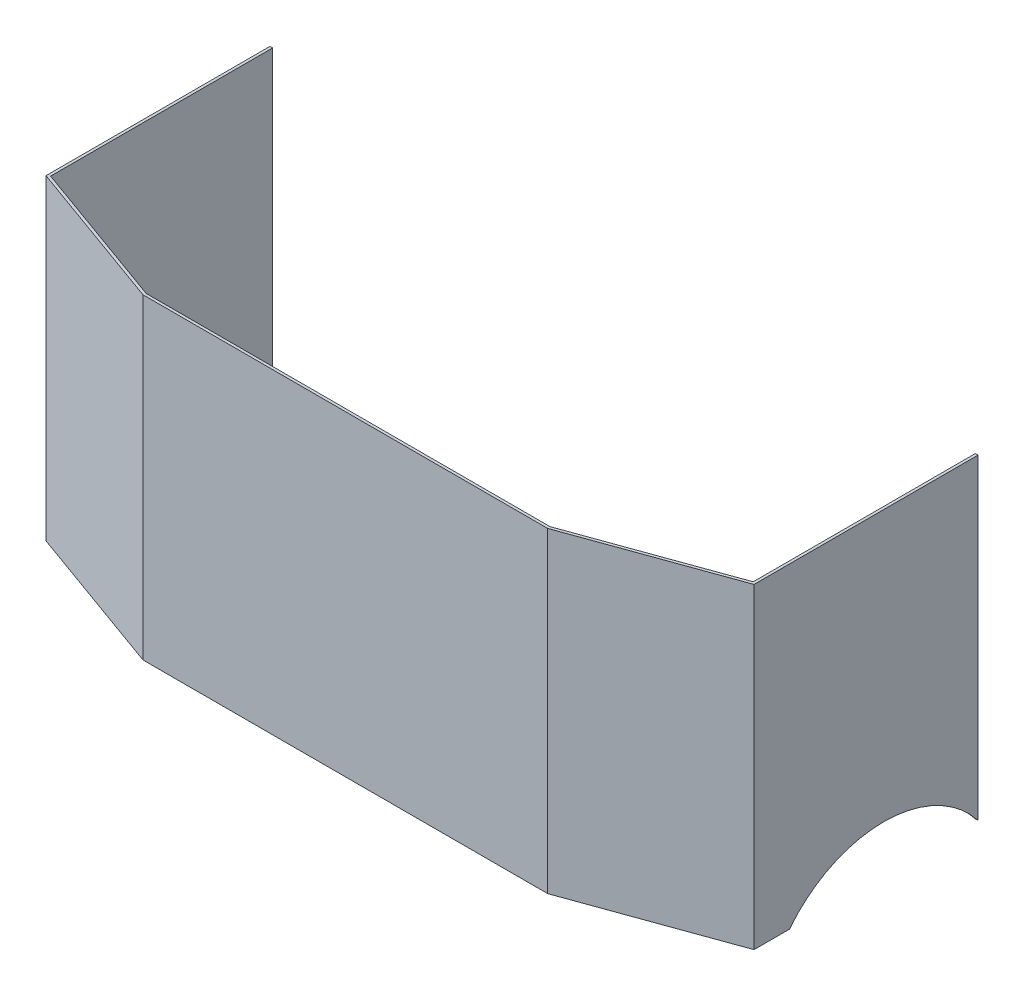
ISO-10303-21;
HEADER;
FILE_DESCRIPTION(('STEP AP214'),'2;1');
FILE_NAME('part.step','',(''),(''),'','','');
FILE_SCHEMA(('AUTOMOTIVE_DESIGN { 1 0 10303 214 1 1 1 1 }'));
ENDSEC;
DATA;
#1=APPLICATION_CONTEXT('core data for automotive mechanical design processes');
#2=APPLICATION_PROTOCOL_DEFINITION('international standard','automotive_design',2000,#1);
#3=PRODUCT_CONTEXT('',#1,'mechanical');
#4=PRODUCT('Part','Part','',(#3));
#5=PRODUCT_RELATED_PRODUCT_CATEGORY('part','',(#4));
#6=PRODUCT_DEFINITION_FORMATION('','',#4);
#7=PRODUCT_DEFINITION_CONTEXT('part definition',#1,'design');
#8=PRODUCT_DEFINITION('design','',#6,#7);
#9=PRODUCT_DEFINITION_SHAPE('','',#8);
#10=(LENGTH_UNIT() NAMED_UNIT(*) SI_UNIT(.MILLI.,.METRE.));
#11=(NAMED_UNIT(*) PLANE_ANGLE_UNIT() SI_UNIT($,.RADIAN.));
#12=(NAMED_UNIT(*) SI_UNIT($,.STERADIAN.) SOLID_ANGLE_UNIT());
#13=UNCERTAINTY_MEASURE_WITH_UNIT(LENGTH_MEASURE(1.E-05),#10,'distance_accuracy_value','');
#14=(GEOMETRIC_REPRESENTATION_CONTEXT(3) GLOBAL_UNCERTAINTY_ASSIGNED_CONTEXT((#13)) GLOBAL_UNIT_ASSIGNED_CONTEXT((#10,
#11,#12)) REPRESENTATION_CONTEXT('',''));
#15=CARTESIAN_POINT('',(0.,0.,0.));
#16=DIRECTION('',(0.,0.,1.));
#17=DIRECTION('',(1.,0.,0.));
#18=AXIS2_PLACEMENT_3D('',#15,#16,#17);
#19=CARTESIAN_POINT('',(0.,0.,0.));
#20=DIRECTION('',(0.,1.,0.));
#21=DIRECTION('',(0.,0.,1.));
#22=AXIS2_PLACEMENT_3D('',#19,#20,#21);
#23=PLANE('',#22);
#24=DIRECTION('',(0.,0.,-1.));
#25=VECTOR('',#24,1.);
#26=CARTESIAN_POINT('',(263.000000064,0.,121.405176327402));
#27=LINE('',#26,#25);
#28=CARTESIAN_POINT('',(263.000000064,0.,-45.0012142751816));
#29=VERTEX_POINT('',#28);
#30=CARTESIAN_POINT('',(263.000000064,0.,-45.0034531183573));
#31=VERTEX_POINT('',#30);
#32=EDGE_CURVE('E148',#29,#31,#27,.T.);
#33=ORIENTED_EDGE('',*,*,#32,.F.);
#34=DIRECTION('',(-1.,0.,0.));
#35=VECTOR('',#34,1.);
#36=CARTESIAN_POINT('',(514.447171453936,0.,-45.0012142751816));
#37=LINE('',#36,#35);
#38=CARTESIAN_POINT('',(261.,0.,-45.0012142751816));
#39=VERTEX_POINT('',#38);
#40=EDGE_CURVE('E11',#29,#39,#37,.T.);
#41=ORIENTED_EDGE('',*,*,#40,.T.);
#42=DIRECTION('',(0.,0.,1.));
#43=VECTOR('',#42,1.);
#44=CARTESIAN_POINT('',(261.,0.,120.));
#45=LINE('',#44,#43);
#46=CARTESIAN_POINT('',(261.,0.,-45.0034531183573));
#47=VERTEX_POINT('',#46);
#48=EDGE_CURVE('E165',#47,#39,#45,.T.);
#49=ORIENTED_EDGE('',*,*,#48,.F.);
#50=DIRECTION('',(-1.,0.,0.));
#51=VECTOR('',#50,1.);
#52=CARTESIAN_POINT('',(263.000000064,0.,-45.0034531183573));
#53=LINE('',#52,#51);
#54=EDGE_CURVE('E156',#31,#47,#53,.T.);
#55=ORIENTED_EDGE('',*,*,#54,.F.);
#56=EDGE_LOOP('',(#33,#41,#49,#55));
#57=FACE_BOUND('',#56,.T.);
#58=ADVANCED_FACE('F33',(#57),#23,.F.);
#59=CARTESIAN_POINT('',(-263.000000064,234.9999999,-45.0012142751814));
#60=DIRECTION('',(-9.02056178642154E-13,0.,1.));
#61=DIRECTION('',(1.,0.,9.02056178642154E-13));
#62=AXIS2_PLACEMENT_3D('',#59,#60,#61);
#63=PLANE('',#62);
#64=DIRECTION('',(-1.,0.,-9.02056178642154E-13));
#65=VECTOR('',#64,1.);
#66=CARTESIAN_POINT('',(-263.000000064,0.,-45.0012142751814));
#67=LINE('',#66,#65);
#68=CARTESIAN_POINT('',(-261.,2.60208521396521E-12,-45.0012142751796));
#69=VERTEX_POINT('',#68);
#70=CARTESIAN_POINT('',(-263.000000064,0.,-45.0012142751816));
#71=VERTEX_POINT('',#70);
#72=EDGE_CURVE('E248',#69,#71,#67,.T.);
#73=ORIENTED_EDGE('',*,*,#72,.T.);
#74=DIRECTION('',(0.,-1.,0.));
#75=VECTOR('',#74,1.);
#76=CARTESIAN_POINT('',(-263.000000064,234.9999999,-45.0012142751814));
#77=LINE('',#76,#75);
#78=CARTESIAN_POINT('',(-263.000000064,234.9999999,-45.0012142751814));
#79=VERTEX_POINT('',#78);
#80=EDGE_CURVE('E209',#79,#71,#77,.T.);
#81=ORIENTED_EDGE('',*,*,#80,.F.);
#82=DIRECTION('',(-1.,0.,-9.02056178642154E-13));
#83=VECTOR('',#82,1.);
#84=CARTESIAN_POINT('',(-263.000000064,234.9999999,-45.0012142751814));
#85=LINE('',#84,#83);
#86=CARTESIAN_POINT('',(-261.,234.9999999,-45.0012142751796));
#87=VERTEX_POINT('',#86);
#88=EDGE_CURVE('E176',#87,#79,#85,.T.);
#89=ORIENTED_EDGE('',*,*,#88,.F.);
#90=DIRECTION('',(0.,-1.,0.));
#91=VECTOR('',#90,1.);
#92=CARTESIAN_POINT('',(-261.,234.9999999,-45.0012142751796));
#93=LINE('',#92,#91);
#94=EDGE_CURVE('E177',#87,#69,#93,.T.);
#95=ORIENTED_EDGE('',*,*,#94,.T.);
#96=EDGE_LOOP('',(#73,#81,#89,#95));
#97=FACE_BOUND('',#96,.T.);
#98=ADVANCED_FACE('F35',(#97),#63,.F.);
#99=CARTESIAN_POINT('',(-263.000000064,234.9999999,-45.0012142751814));
#100=DIRECTION('',(1.,0.,0.));
#101=DIRECTION('',(0.,0.,-1.));
#102=AXIS2_PLACEMENT_3D('',#99,#100,#101);
#103=PLANE('',#102);
#104=ORIENTED_EDGE('',*,*,#80,.T.);
#105=CARTESIAN_POINT('',(-263.000000064,-54.8000000803362,24.9999999371103));
#106=DIRECTION('',(-1.,0.,0.));
#107=DIRECTION('',(0.,0.,1.));
#108=AXIS2_PLACEMENT_3D('',#105,#106,#107);
#109=CIRCLE('',#108,88.9000000000002);
#110=CARTESIAN_POINT('',(-263.000000064,0.,95.0012141494022));
#111=VERTEX_POINT('',#110);
#112=EDGE_CURVE('E153',#111,#71,#109,.T.);
#113=ORIENTED_EDGE('',*,*,#112,.F.);
#114=DIRECTION('',(0.,0.,1.));
#115=VECTOR('',#114,1.);
#116=CARTESIAN_POINT('',(-263.000000064,0.,-45.0012142751814));
#117=LINE('',#116,#115);
#118=CARTESIAN_POINT('',(-263.000000064,0.,121.405176327402));
#119=VERTEX_POINT('',#118);
#120=EDGE_CURVE('E219',#111,#119,#117,.T.);
#121=ORIENTED_EDGE('',*,*,#120,.T.);
#122=DIRECTION('',(0.,-1.,0.));
#123=VECTOR('',#122,1.);
#124=CARTESIAN_POINT('',(-263.000000064,234.9999999,121.405176327402));
#125=LINE('',#124,#123);
#126=CARTESIAN_POINT('',(-263.000000064,234.9999999,121.405176327402));
#127=VERTEX_POINT('',#126);
#128=EDGE_CURVE('E206',#127,#119,#125,.T.);
#129=ORIENTED_EDGE('',*,*,#128,.F.);
#130=DIRECTION('',(0.,0.,1.));
#131=VECTOR('',#130,1.);
#132=CARTESIAN_POINT('',(-263.000000064,234.9999999,-45.0012142751814));
#133=LINE('',#132,#131);
#134=EDGE_CURVE('E254',#79,#127,#133,.T.);
#135=ORIENTED_EDGE('',*,*,#134,.F.);
#136=EDGE_LOOP('',(#104,#113,#121,#129,#135));
#137=FACE_BOUND('',#136,.T.);
#138=ADVANCED_FACE('F294',(#137),#103,.F.);
#139=CARTESIAN_POINT('',(-263.000000064,234.9999999,121.405176327402));
#140=DIRECTION('',(0.339019574601853,0.,-0.940779319520141));
#141=DIRECTION('',(-0.940779319520141,0.,-0.339019574601853));
#142=AXIS2_PLACEMENT_3D('',#139,#140,#141);
#143=PLANE('',#142);
#144=DIRECTION('',(0.94077931952014,0.,0.339019574601853));
#145=VECTOR('',#144,1.);
#146=CARTESIAN_POINT('',(-263.000000064,0.,121.405176327402));
#147=LINE('',#146,#145);
#148=CARTESIAN_POINT('',(-150.349364372541,0.,162.));
#149=VERTEX_POINT('',#148);
#150=EDGE_CURVE('E274',#119,#149,#147,.T.);
#151=ORIENTED_EDGE('',*,*,#150,.T.);
#152=DIRECTION('',(0.,-1.,0.));
#153=VECTOR('',#152,1.);
#154=CARTESIAN_POINT('',(-150.349364372541,234.9999999,162.));
#155=LINE('',#154,#153);
#156=CARTESIAN_POINT('',(-150.349364372541,234.9999999,162.));
#157=VERTEX_POINT('',#156);
#158=EDGE_CURVE('E203',#157,#149,#155,.T.);
#159=ORIENTED_EDGE('',*,*,#158,.F.);
#160=DIRECTION('',(0.94077931952014,0.,0.339019574601853));
#161=VECTOR('',#160,1.);
#162=CARTESIAN_POINT('',(-263.000000064,234.9999999,121.405176327402));
#163=LINE('',#162,#161);
#164=EDGE_CURVE('E256',#127,#157,#163,.T.);
#165=ORIENTED_EDGE('',*,*,#164,.F.);
#166=ORIENTED_EDGE('',*,*,#128,.T.);
#167=EDGE_LOOP('',(#151,#159,#165,#166));
#168=FACE_BOUND('',#167,.T.);
#169=ADVANCED_FACE('F292',(#168),#143,.F.);
#170=CARTESIAN_POINT('',(-150.349364372541,234.9999999,162.));
#171=DIRECTION('',(0.,0.,-1.));
#172=DIRECTION('',(-1.,0.,0.));
#173=AXIS2_PLACEMENT_3D('',#170,#171,#172);
#174=PLANE('',#173);
#175=DIRECTION('',(1.,0.,0.));
#176=VECTOR('',#175,1.);
#177=CARTESIAN_POINT('',(-150.349364372541,0.,162.));
#178=LINE('',#177,#176);
#179=CARTESIAN_POINT('',(150.34936437254,0.,162.));
#180=VERTEX_POINT('',#179);
#181=EDGE_CURVE('E159',#149,#180,#178,.T.);
#182=ORIENTED_EDGE('',*,*,#181,.T.);
#183=DIRECTION('',(0.,-1.,0.));
#184=VECTOR('',#183,1.);
#185=CARTESIAN_POINT('',(150.34936437254,234.9999999,162.));
#186=LINE('',#185,#184);
#187=CARTESIAN_POINT('',(150.34936437254,234.9999999,162.));
#188=VERTEX_POINT('',#187);
#189=EDGE_CURVE('E200',#188,#180,#186,.T.);
#190=ORIENTED_EDGE('',*,*,#189,.F.);
#191=DIRECTION('',(1.,0.,0.));
#192=VECTOR('',#191,1.);
#193=CARTESIAN_POINT('',(-150.349364372541,234.9999999,162.));
#194=LINE('',#193,#192);
#195=EDGE_CURVE('E258',#157,#188,#194,.T.);
#196=ORIENTED_EDGE('',*,*,#195,.F.);
#197=ORIENTED_EDGE('',*,*,#158,.T.);
#198=EDGE_LOOP('',(#182,#190,#196,#197));
#199=FACE_BOUND('',#198,.T.);
#200=ADVANCED_FACE('F278',(#199),#174,.F.);
#201=CARTESIAN_POINT('',(150.34936437254,234.9999999,162.));
#202=DIRECTION('',(-0.339019574601853,0.,-0.940779319520141));
#203=DIRECTION('',(-0.940779319520141,0.,0.339019574601853));
#204=AXIS2_PLACEMENT_3D('',#201,#202,#203);
#205=PLANE('',#204);
#206=DIRECTION('',(0.94077931952014,0.,-0.339019574601853));
#207=VECTOR('',#206,1.);
#208=CARTESIAN_POINT('',(150.34936437254,0.,162.));
#209=LINE('',#208,#207);
#210=CARTESIAN_POINT('',(263.000000064,0.,121.405176327402));
#211=VERTEX_POINT('',#210);
#212=EDGE_CURVE('E157',#180,#211,#209,.T.);
#213=ORIENTED_EDGE('',*,*,#212,.T.);
#214=DIRECTION('',(0.,-1.,0.));
#215=VECTOR('',#214,1.);
#216=CARTESIAN_POINT('',(263.000000064,234.9999999,121.405176327402));
#217=LINE('',#216,#215);
#218=CARTESIAN_POINT('',(263.000000064,234.9999999,121.405176327402));
#219=VERTEX_POINT('',#218);
#220=EDGE_CURVE('E198',#219,#211,#217,.T.);
#221=ORIENTED_EDGE('',*,*,#220,.F.);
#222=DIRECTION('',(0.94077931952014,0.,-0.339019574601853));
#223=VECTOR('',#222,1.);
#224=CARTESIAN_POINT('',(150.34936437254,234.9999999,162.));
#225=LINE('',#224,#223);
#226=EDGE_CURVE('E260',#188,#219,#225,.T.);
#227=ORIENTED_EDGE('',*,*,#226,.F.);
#228=ORIENTED_EDGE('',*,*,#189,.T.);
#229=EDGE_LOOP('',(#213,#221,#227,#228));
#230=FACE_BOUND('',#229,.T.);
#231=ADVANCED_FACE('F284',(#230),#205,.F.);
#232=CARTESIAN_POINT('',(263.000000064,234.9999999,121.405176327402));
#233=DIRECTION('',(-1.,0.,0.));
#234=DIRECTION('',(0.,0.,1.));
#235=AXIS2_PLACEMENT_3D('',#232,#233,#234);
#236=PLANE('',#235);
#237=CARTESIAN_POINT('',(263.000000064,0.,95.0012141494022));
#238=VERTEX_POINT('',#237);
#239=EDGE_CURVE('E152',#211,#238,#27,.T.);
#240=ORIENTED_EDGE('',*,*,#239,.T.);
#241=CARTESIAN_POINT('',(263.000000064,-54.8000000803362,24.9999999371103));
#242=DIRECTION('',(-1.,0.,0.));
#243=DIRECTION('',(0.,0.,1.));
#244=AXIS2_PLACEMENT_3D('',#241,#242,#243);
#245=CIRCLE('',#244,88.9000000000002);
#246=EDGE_CURVE('E48',#29,#238,#245,.F.);
#247=ORIENTED_EDGE('',*,*,#246,.F.);
#248=ORIENTED_EDGE('',*,*,#32,.T.);
#249=DIRECTION('',(0.,-1.,0.));
#250=VECTOR('',#249,1.);
#251=CARTESIAN_POINT('',(263.000000064,234.9999999,-45.0034531183573));
#252=LINE('',#251,#250);
#253=CARTESIAN_POINT('',(263.000000064,234.9999999,-45.0034531183573));
#254=VERTEX_POINT('',#253);
#255=EDGE_CURVE('E196',#254,#31,#252,.T.);
#256=ORIENTED_EDGE('',*,*,#255,.F.);
#257=DIRECTION('',(0.,0.,-1.));
#258=VECTOR('',#257,1.);
#259=CARTESIAN_POINT('',(263.000000064,234.9999999,121.405176327402));
#260=LINE('',#259,#258);
#261=EDGE_CURVE('E262',#219,#254,#260,.T.);
#262=ORIENTED_EDGE('',*,*,#261,.F.);
#263=ORIENTED_EDGE('',*,*,#220,.T.);
#264=EDGE_LOOP('',(#240,#247,#248,#256,#262,#263));
#265=FACE_BOUND('',#264,.T.);
#266=ADVANCED_FACE('F146',(#265),#236,.F.);
#267=CARTESIAN_POINT('',(263.000000064,234.9999999,-45.0034531183573));
#268=DIRECTION('',(0.,0.,1.));
#269=DIRECTION('',(1.,0.,0.));
#270=AXIS2_PLACEMENT_3D('',#267,#268,#269);
#271=PLANE('',#270);
#272=ORIENTED_EDGE('',*,*,#54,.T.);
#273=DIRECTION('',(0.,-1.,0.));
#274=VECTOR('',#273,1.);
#275=CARTESIAN_POINT('',(261.,234.9999999,-45.0034531183573));
#276=LINE('',#275,#274);
#277=CARTESIAN_POINT('',(261.,234.9999999,-45.0034531183573));
#278=VERTEX_POINT('',#277);
#279=EDGE_CURVE('E193',#278,#47,#276,.T.);
#280=ORIENTED_EDGE('',*,*,#279,.F.);
#281=DIRECTION('',(-1.,0.,0.));
#282=VECTOR('',#281,1.);
#283=CARTESIAN_POINT('',(263.000000064,234.9999999,-45.0034531183573));
#284=LINE('',#283,#282);
#285=EDGE_CURVE('E264',#254,#278,#284,.T.);
#286=ORIENTED_EDGE('',*,*,#285,.F.);
#287=ORIENTED_EDGE('',*,*,#255,.T.);
#288=EDGE_LOOP('',(#272,#280,#286,#287));
#289=FACE_BOUND('',#288,.T.);
#290=ADVANCED_FACE('F302',(#289),#271,.F.);
#291=CARTESIAN_POINT('',(261.,234.9999999,120.));
#292=DIRECTION('',(1.,0.,0.));
#293=DIRECTION('',(0.,0.,-1.));
#294=AXIS2_PLACEMENT_3D('',#291,#292,#293);
#295=PLANE('',#294);
#296=ORIENTED_EDGE('',*,*,#48,.T.);
#297=CARTESIAN_POINT('',(261.,-54.8000000803362,24.9999999371103));
#298=DIRECTION('',(1.,0.,0.));
#299=DIRECTION('',(0.,0.,-1.));
#300=AXIS2_PLACEMENT_3D('',#297,#298,#299);
#301=CIRCLE('',#300,88.9000000000002);
#302=CARTESIAN_POINT('',(261.,0.,95.0012141494022));
#303=VERTEX_POINT('',#302);
#304=EDGE_CURVE('E139',#39,#303,#301,.T.);
#305=ORIENTED_EDGE('',*,*,#304,.T.);
#306=CARTESIAN_POINT('',(261.,0.,120.));
#307=VERTEX_POINT('',#306);
#308=EDGE_CURVE('E164',#303,#307,#45,.T.);
#309=ORIENTED_EDGE('',*,*,#308,.T.);
#310=DIRECTION('',(0.,-1.,0.));
#311=VECTOR('',#310,1.);
#312=CARTESIAN_POINT('',(261.,234.9999999,120.));
#313=LINE('',#312,#311);
#314=CARTESIAN_POINT('',(261.,234.9999999,120.));
#315=VERTEX_POINT('',#314);
#316=EDGE_CURVE('E190',#315,#307,#313,.T.);
#317=ORIENTED_EDGE('',*,*,#316,.F.);
#318=DIRECTION('',(0.,0.,1.));
#319=VECTOR('',#318,1.);
#320=CARTESIAN_POINT('',(261.,234.9999999,120.));
#321=LINE('',#320,#319);
#322=EDGE_CURVE('E246',#278,#315,#321,.T.);
#323=ORIENTED_EDGE('',*,*,#322,.F.);
#324=ORIENTED_EDGE('',*,*,#279,.T.);
#325=EDGE_LOOP('',(#296,#305,#309,#317,#323,#324));
#326=FACE_BOUND('',#325,.T.);
#327=ADVANCED_FACE('F245',(#326),#295,.F.);
#328=CARTESIAN_POINT('',(150.,234.9999999,160.));
#329=DIRECTION('',(0.339019574601852,0.,0.940779319520141));
#330=DIRECTION('',(0.940779319520141,0.,-0.339019574601852));
#331=AXIS2_PLACEMENT_3D('',#328,#329,#330);
#332=PLANE('',#331);
#333=DIRECTION('',(-0.940779319520141,0.,0.339019574601852));
#334=VECTOR('',#333,1.);
#335=CARTESIAN_POINT('',(150.,0.,160.));
#336=LINE('',#335,#334);
#337=CARTESIAN_POINT('',(150.,0.,160.));
#338=VERTEX_POINT('',#337);
#339=EDGE_CURVE('E167',#307,#338,#336,.T.);
#340=ORIENTED_EDGE('',*,*,#339,.T.);
#341=DIRECTION('',(0.,-1.,0.));
#342=VECTOR('',#341,1.);
#343=CARTESIAN_POINT('',(150.,234.9999999,160.));
#344=LINE('',#343,#342);
#345=CARTESIAN_POINT('',(150.,234.9999999,160.));
#346=VERTEX_POINT('',#345);
#347=EDGE_CURVE('E187',#346,#338,#344,.T.);
#348=ORIENTED_EDGE('',*,*,#347,.F.);
#349=DIRECTION('',(-0.940779319520141,0.,0.339019574601852));
#350=VECTOR('',#349,1.);
#351=CARTESIAN_POINT('',(150.,234.9999999,160.));
#352=LINE('',#351,#350);
#353=EDGE_CURVE('E241',#315,#346,#352,.T.);
#354=ORIENTED_EDGE('',*,*,#353,.F.);
#355=ORIENTED_EDGE('',*,*,#316,.T.);
#356=EDGE_LOOP('',(#340,#348,#354,#355));
#357=FACE_BOUND('',#356,.T.);
#358=ADVANCED_FACE('F240',(#357),#332,.F.);
#359=CARTESIAN_POINT('',(-150.,234.9999999,160.));
#360=DIRECTION('',(0.,0.,1.));
#361=DIRECTION('',(1.,0.,0.));
#362=AXIS2_PLACEMENT_3D('',#359,#360,#361);
#363=PLANE('',#362);
#364=DIRECTION('',(-1.,0.,0.));
#365=VECTOR('',#364,1.);
#366=CARTESIAN_POINT('',(-150.,0.,160.));
#367=LINE('',#366,#365);
#368=CARTESIAN_POINT('',(-150.,0.,160.));
#369=VERTEX_POINT('',#368);
#370=EDGE_CURVE('E169',#338,#369,#367,.T.);
#371=ORIENTED_EDGE('',*,*,#370,.T.);
#372=DIRECTION('',(0.,-1.,0.));
#373=VECTOR('',#372,1.);
#374=CARTESIAN_POINT('',(-150.,234.9999999,160.));
#375=LINE('',#374,#373);
#376=CARTESIAN_POINT('',(-150.,234.9999999,160.));
#377=VERTEX_POINT('',#376);
#378=EDGE_CURVE('E184',#377,#369,#375,.T.);
#379=ORIENTED_EDGE('',*,*,#378,.F.);
#380=DIRECTION('',(-1.,0.,0.));
#381=VECTOR('',#380,1.);
#382=CARTESIAN_POINT('',(-150.,234.9999999,160.));
#383=LINE('',#382,#381);
#384=EDGE_CURVE('E237',#346,#377,#383,.T.);
#385=ORIENTED_EDGE('',*,*,#384,.F.);
#386=ORIENTED_EDGE('',*,*,#347,.T.);
#387=EDGE_LOOP('',(#371,#379,#385,#386));
#388=FACE_BOUND('',#387,.T.);
#389=ADVANCED_FACE('F234',(#388),#363,.F.);
#390=CARTESIAN_POINT('',(-261.,234.9999999,120.));
#391=DIRECTION('',(-0.339019574601853,0.,0.940779319520141));
#392=DIRECTION('',(0.940779319520141,0.,0.339019574601853));
#393=AXIS2_PLACEMENT_3D('',#390,#391,#392);
#394=PLANE('',#393);
#395=DIRECTION('',(-0.940779319520141,0.,-0.339019574601853));
#396=VECTOR('',#395,1.);
#397=CARTESIAN_POINT('',(-261.,0.,120.));
#398=LINE('',#397,#396);
#399=CARTESIAN_POINT('',(-261.,0.,120.));
#400=VERTEX_POINT('',#399);
#401=EDGE_CURVE('E171',#369,#400,#398,.T.);
#402=ORIENTED_EDGE('',*,*,#401,.T.);
#403=DIRECTION('',(0.,-1.,0.));
#404=VECTOR('',#403,1.);
#405=CARTESIAN_POINT('',(-261.,234.9999999,120.));
#406=LINE('',#405,#404);
#407=CARTESIAN_POINT('',(-261.,234.9999999,120.));
#408=VERTEX_POINT('',#407);
#409=EDGE_CURVE('E180',#408,#400,#406,.T.);
#410=ORIENTED_EDGE('',*,*,#409,.F.);
#411=DIRECTION('',(-0.940779319520141,0.,-0.339019574601853));
#412=VECTOR('',#411,1.);
#413=CARTESIAN_POINT('',(-261.,234.9999999,120.));
#414=LINE('',#413,#412);
#415=EDGE_CURVE('E229',#377,#408,#414,.T.);
#416=ORIENTED_EDGE('',*,*,#415,.F.);
#417=ORIENTED_EDGE('',*,*,#378,.T.);
#418=EDGE_LOOP('',(#402,#410,#416,#417));
#419=FACE_BOUND('',#418,.T.);
#420=ADVANCED_FACE('F228',(#419),#394,.F.);
#421=CARTESIAN_POINT('',(-261.,234.9999999,120.));
#422=DIRECTION('',(-1.,0.,0.));
#423=DIRECTION('',(0.,0.,1.));
#424=AXIS2_PLACEMENT_3D('',#421,#422,#423);
#425=PLANE('',#424);
#426=DIRECTION('',(0.,0.,-1.));
#427=VECTOR('',#426,1.);
#428=CARTESIAN_POINT('',(-261.,0.,120.));
#429=LINE('',#428,#427);
#430=CARTESIAN_POINT('',(-261.,0.,95.0012141494022));
#431=VERTEX_POINT('',#430);
#432=EDGE_CURVE('E173',#400,#431,#429,.T.);
#433=ORIENTED_EDGE('',*,*,#432,.T.);
#434=CARTESIAN_POINT('',(-261.,-54.8000000803362,24.9999999371103));
#435=DIRECTION('',(-1.,0.,0.));
#436=DIRECTION('',(0.,0.,1.));
#437=AXIS2_PLACEMENT_3D('',#434,#435,#436);
#438=CIRCLE('',#437,88.9000000000002);
#439=EDGE_CURVE('E56',#431,#69,#438,.T.);
#440=ORIENTED_EDGE('',*,*,#439,.T.);
#441=ORIENTED_EDGE('',*,*,#94,.F.);
#442=DIRECTION('',(0.,0.,-1.));
#443=VECTOR('',#442,1.);
#444=CARTESIAN_POINT('',(-261.,234.9999999,120.));
#445=LINE('',#444,#443);
#446=EDGE_CURVE('E181',#408,#87,#445,.T.);
#447=ORIENTED_EDGE('',*,*,#446,.F.);
#448=ORIENTED_EDGE('',*,*,#409,.T.);
#449=EDGE_LOOP('',(#433,#440,#441,#447,#448));
#450=FACE_BOUND('',#449,.T.);
#451=ADVANCED_FACE('F222',(#450),#425,.F.);
#452=CARTESIAN_POINT('',(0.,234.9999999,0.));
#453=DIRECTION('',(0.,1.,0.));
#454=DIRECTION('',(0.,0.,1.));
#455=AXIS2_PLACEMENT_3D('',#452,#453,#454);
#456=PLANE('',#455);
#457=ORIENTED_EDGE('',*,*,#88,.T.);
#458=ORIENTED_EDGE('',*,*,#134,.T.);
#459=ORIENTED_EDGE('',*,*,#164,.T.);
#460=ORIENTED_EDGE('',*,*,#195,.T.);
#461=ORIENTED_EDGE('',*,*,#226,.T.);
#462=ORIENTED_EDGE('',*,*,#261,.T.);
#463=ORIENTED_EDGE('',*,*,#285,.T.);
#464=ORIENTED_EDGE('',*,*,#322,.T.);
#465=ORIENTED_EDGE('',*,*,#353,.T.);
#466=ORIENTED_EDGE('',*,*,#384,.T.);
#467=ORIENTED_EDGE('',*,*,#415,.T.);
#468=ORIENTED_EDGE('',*,*,#446,.T.);
#469=EDGE_LOOP('',(#457,#458,#459,#460,#461,#462,#463,#464,#465,#466,#467,#468));
#470=FACE_BOUND('',#469,.T.);
#471=ADVANCED_FACE('F288',(#470),#456,.T.);
#472=ORIENTED_EDGE('',*,*,#120,.F.);
#473=DIRECTION('',(-1.,0.,0.));
#474=VECTOR('',#473,1.);
#475=CARTESIAN_POINT('',(514.447171453936,0.,95.0012141494022));
#476=LINE('',#475,#474);
#477=EDGE_CURVE('E41',#111,#431,#476,.F.);
#478=ORIENTED_EDGE('',*,*,#477,.T.);
#479=ORIENTED_EDGE('',*,*,#432,.F.);
#480=ORIENTED_EDGE('',*,*,#401,.F.);
#481=ORIENTED_EDGE('',*,*,#370,.F.);
#482=ORIENTED_EDGE('',*,*,#339,.F.);
#483=ORIENTED_EDGE('',*,*,#308,.F.);
#484=EDGE_CURVE('E211',#303,#238,#476,.F.);
#485=ORIENTED_EDGE('',*,*,#484,.T.);
#486=ORIENTED_EDGE('',*,*,#239,.F.);
#487=ORIENTED_EDGE('',*,*,#212,.F.);
#488=ORIENTED_EDGE('',*,*,#181,.F.);
#489=ORIENTED_EDGE('',*,*,#150,.F.);
#490=EDGE_LOOP('',(#472,#478,#479,#480,#481,#482,#483,#485,#486,#487,#488,#489));
#491=FACE_BOUND('',#490,.T.);
#492=ADVANCED_FACE('F216',(#491),#23,.F.);
#493=CARTESIAN_POINT('',(514.447171453936,-54.8000000803362,24.9999999371103));
#494=DIRECTION('',(-1.,0.,0.));
#495=DIRECTION('',(0.,0.,1.));
#496=AXIS2_PLACEMENT_3D('',#493,#494,#495);
#497=CYLINDRICAL_SURFACE('',#496,88.9000000000002);
#498=ORIENTED_EDGE('',*,*,#246,.T.);
#499=ORIENTED_EDGE('',*,*,#484,.F.);
#500=ORIENTED_EDGE('',*,*,#304,.F.);
#501=ORIENTED_EDGE('',*,*,#40,.F.);
#502=EDGE_LOOP('',(#498,#499,#500,#501));
#503=FACE_BOUND('',#502,.T.);
#504=ADVANCED_FACE('F137',(#503),#497,.F.);
#505=ORIENTED_EDGE('',*,*,#439,.F.);
#506=ORIENTED_EDGE('',*,*,#477,.F.);
#507=ORIENTED_EDGE('',*,*,#112,.T.);
#508=ORIENTED_EDGE('',*,*,#72,.F.);
#509=EDGE_LOOP('',(#505,#506,#507,#508));
#510=FACE_BOUND('',#509,.T.);
#511=ADVANCED_FACE('F296',(#510),#497,.F.);
#512=CLOSED_SHELL('',(#58,#98,#138,#169,#200,#231,#266,#290,#327,#358,#389,#420,#451,#471,#492,
#504,#511));
#513=MANIFOLD_SOLID_BREP('B2',#512);
#514=ADVANCED_BREP_SHAPE_REPRESENTATION('',(#18,#513),#14);
#515=SHAPE_DEFINITION_REPRESENTATION(#9,#514);
ENDSEC;
END-ISO-10303-21;
